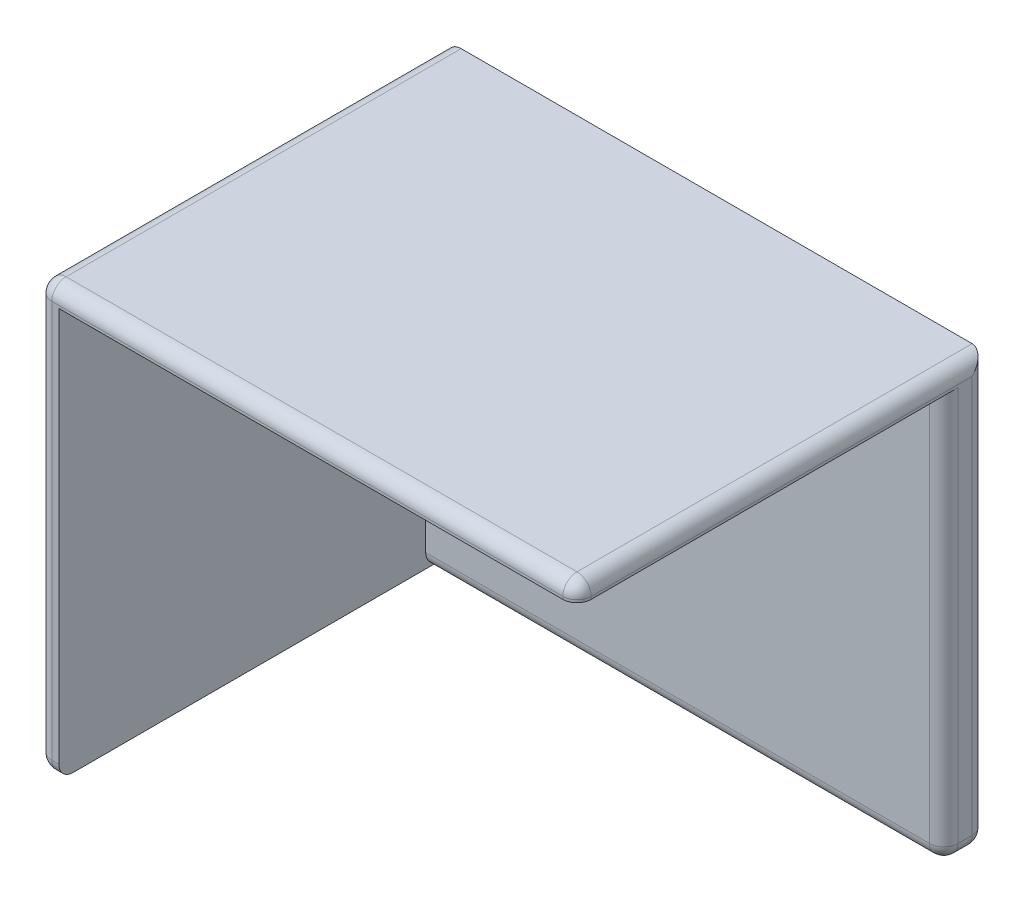
ISO-10303-21;
HEADER;
FILE_DESCRIPTION(('STEP AP214'),'2;1');
FILE_NAME('part.step','',(''),(''),'','','');
FILE_SCHEMA(('AUTOMOTIVE_DESIGN { 1 0 10303 214 1 1 1 1 }'));
ENDSEC;
DATA;
#1=APPLICATION_CONTEXT('core data for automotive mechanical design processes');
#2=APPLICATION_PROTOCOL_DEFINITION('international standard','automotive_design',2000,#1);
#3=PRODUCT_CONTEXT('',#1,'mechanical');
#4=PRODUCT('Part','Part','',(#3));
#5=PRODUCT_RELATED_PRODUCT_CATEGORY('part','',(#4));
#6=PRODUCT_DEFINITION_FORMATION('','',#4);
#7=PRODUCT_DEFINITION_CONTEXT('part definition',#1,'design');
#8=PRODUCT_DEFINITION('design','',#6,#7);
#9=PRODUCT_DEFINITION_SHAPE('','',#8);
#10=(LENGTH_UNIT() NAMED_UNIT(*) SI_UNIT(.MILLI.,.METRE.));
#11=(NAMED_UNIT(*) PLANE_ANGLE_UNIT() SI_UNIT($,.RADIAN.));
#12=(NAMED_UNIT(*) SI_UNIT($,.STERADIAN.) SOLID_ANGLE_UNIT());
#13=UNCERTAINTY_MEASURE_WITH_UNIT(LENGTH_MEASURE(1.E-05),#10,'distance_accuracy_value','');
#14=(GEOMETRIC_REPRESENTATION_CONTEXT(3) GLOBAL_UNCERTAINTY_ASSIGNED_CONTEXT((#13)) GLOBAL_UNIT_ASSIGNED_CONTEXT((#10,
#11,#12)) REPRESENTATION_CONTEXT('',''));
#15=CARTESIAN_POINT('',(0.,0.,0.));
#16=DIRECTION('',(0.,0.,1.));
#17=DIRECTION('',(1.,0.,0.));
#18=AXIS2_PLACEMENT_3D('',#15,#16,#17);
#19=CARTESIAN_POINT('',(-17.5,-13.8157894736842,28.84));
#20=DIRECTION('',(1.,0.,0.));
#21=DIRECTION('',(0.,0.,-1.));
#22=AXIS2_PLACEMENT_3D('',#19,#20,#21);
#23=PLANE('',#22);
#24=DIRECTION('',(0.,-1.,0.));
#25=VECTOR('',#24,1.);
#26=CARTESIAN_POINT('',(-17.5,-13.8157894736842,28.84));
#27=LINE('',#26,#25);
#28=CARTESIAN_POINT('',(-17.5,13.8157894736842,28.84));
#29=VERTEX_POINT('',#28);
#30=CARTESIAN_POINT('',(-17.5,-14.,28.84));
#31=VERTEX_POINT('',#30);
#32=EDGE_CURVE('E153',#29,#31,#27,.T.);
#33=ORIENTED_EDGE('',*,*,#32,.T.);
#34=CARTESIAN_POINT('',(-17.5,-14.,27.84));
#35=DIRECTION('',(-1.,0.,0.));
#36=DIRECTION('',(0.,0.,1.));
#37=AXIS2_PLACEMENT_3D('',#34,#35,#36);
#38=CIRCLE('',#37,1.);
#39=CARTESIAN_POINT('',(-17.5,-15.,27.84));
#40=VERTEX_POINT('',#39);
#41=EDGE_CURVE('E147',#31,#40,#38,.F.);
#42=ORIENTED_EDGE('',*,*,#41,.T.);
#43=DIRECTION('',(0.,0.,-1.));
#44=VECTOR('',#43,1.);
#45=CARTESIAN_POINT('',(-17.5,-15.,28.84));
#46=LINE('',#45,#44);
#47=CARTESIAN_POINT('',(-17.5,-15.,2.));
#48=VERTEX_POINT('',#47);
#49=EDGE_CURVE('E149',#40,#48,#46,.T.);
#50=ORIENTED_EDGE('',*,*,#49,.T.);
#51=CARTESIAN_POINT('',(-17.5,-14.,2.));
#52=DIRECTION('',(1.,0.,0.));
#53=DIRECTION('',(0.,0.,-1.));
#54=AXIS2_PLACEMENT_3D('',#51,#52,#53);
#55=CIRCLE('',#54,1.);
#56=CARTESIAN_POINT('',(-17.5,-14.,3.));
#57=VERTEX_POINT('',#56);
#58=EDGE_CURVE('E44',#48,#57,#55,.F.);
#59=ORIENTED_EDGE('',*,*,#58,.T.);
#60=DIRECTION('',(0.,1.,0.));
#61=VECTOR('',#60,1.);
#62=CARTESIAN_POINT('',(-17.5,13.8157894736842,3.));
#63=LINE('',#62,#61);
#64=CARTESIAN_POINT('',(-17.5,13.8157894736842,3.));
#65=VERTEX_POINT('',#64);
#66=EDGE_CURVE('E297',#57,#65,#63,.T.);
#67=ORIENTED_EDGE('',*,*,#66,.T.);
#68=DIRECTION('',(0.,0.,-1.));
#69=VECTOR('',#68,1.);
#70=CARTESIAN_POINT('',(-17.5,13.8157894736842,28.84));
#71=LINE('',#70,#69);
#72=EDGE_CURVE('E288',#29,#65,#71,.T.);
#73=ORIENTED_EDGE('',*,*,#72,.F.);
#74=EDGE_LOOP('',(#33,#42,#50,#59,#67,#73));
#75=FACE_BOUND('',#74,.T.);
#76=ADVANCED_FACE('F35',(#75),#23,.T.);
#77=CARTESIAN_POINT('',(17.5,13.8157894736842,28.84));
#78=DIRECTION('',(0.,-1.,0.));
#79=DIRECTION('',(0.,0.,-1.));
#80=AXIS2_PLACEMENT_3D('',#77,#78,#79);
#81=PLANE('',#80);
#82=ORIENTED_EDGE('',*,*,#72,.T.);
#83=DIRECTION('',(1.,0.,0.));
#84=VECTOR('',#83,1.);
#85=CARTESIAN_POINT('',(17.5,13.8157894736842,3.));
#86=LINE('',#85,#84);
#87=CARTESIAN_POINT('',(18.,13.8157894736842,3.));
#88=VERTEX_POINT('',#87);
#89=EDGE_CURVE('E294',#65,#88,#86,.T.);
#90=ORIENTED_EDGE('',*,*,#89,.T.);
#91=CARTESIAN_POINT('',(18.,13.8157894736842,2.));
#92=DIRECTION('',(0.,-1.,0.));
#93=DIRECTION('',(0.,0.,-1.));
#94=AXIS2_PLACEMENT_3D('',#91,#92,#93);
#95=CIRCLE('',#94,1.);
#96=CARTESIAN_POINT('',(19.,13.8157894736842,2.));
#97=VERTEX_POINT('',#96);
#98=EDGE_CURVE('E11',#88,#97,#95,.F.);
#99=ORIENTED_EDGE('',*,*,#98,.T.);
#100=DIRECTION('',(0.,0.,-1.));
#101=VECTOR('',#100,1.);
#102=CARTESIAN_POINT('',(19.,13.8157894736842,28.84));
#103=LINE('',#102,#101);
#104=CARTESIAN_POINT('',(19.,13.8157894736842,27.84));
#105=VERTEX_POINT('',#104);
#106=EDGE_CURVE('E159',#105,#97,#103,.T.);
#107=ORIENTED_EDGE('',*,*,#106,.F.);
#108=CARTESIAN_POINT('',(18.,13.8157894736842,27.84));
#109=DIRECTION('',(0.,1.,0.));
#110=DIRECTION('',(0.,0.,1.));
#111=AXIS2_PLACEMENT_3D('',#108,#109,#110);
#112=CIRCLE('',#111,1.);
#113=CARTESIAN_POINT('',(18.,13.8157894736842,28.84));
#114=VERTEX_POINT('',#113);
#115=EDGE_CURVE('E158',#105,#114,#112,.F.);
#116=ORIENTED_EDGE('',*,*,#115,.T.);
#117=DIRECTION('',(-1.,0.,0.));
#118=VECTOR('',#117,1.);
#119=CARTESIAN_POINT('',(17.5,13.8157894736842,28.84));
#120=LINE('',#119,#118);
#121=EDGE_CURVE('E291',#114,#29,#120,.T.);
#122=ORIENTED_EDGE('',*,*,#121,.T.);
#123=EDGE_LOOP('',(#82,#90,#99,#107,#116,#122));
#124=FACE_BOUND('',#123,.T.);
#125=ADVANCED_FACE('F310',(#124),#81,.T.);
#126=CARTESIAN_POINT('',(0.,0.,28.84));
#127=DIRECTION('',(0.,0.,1.));
#128=DIRECTION('',(1.,0.,0.));
#129=AXIS2_PLACEMENT_3D('',#126,#127,#128);
#130=PLANE('',#129);
#131=ORIENTED_EDGE('',*,*,#121,.F.);
#132=DIRECTION('',(0.,1.,0.));
#133=VECTOR('',#132,1.);
#134=CARTESIAN_POINT('',(18.,15.,28.84));
#135=LINE('',#134,#133);
#136=CARTESIAN_POINT('',(18.,14.,28.84));
#137=VERTEX_POINT('',#136);
#138=EDGE_CURVE('E180',#114,#137,#135,.T.);
#139=ORIENTED_EDGE('',*,*,#138,.T.);
#140=DIRECTION('',(-1.,0.,0.));
#141=VECTOR('',#140,1.);
#142=CARTESIAN_POINT('',(-19.,14.,28.84));
#143=LINE('',#142,#141);
#144=CARTESIAN_POINT('',(-18.,14.,28.84));
#145=VERTEX_POINT('',#144);
#146=EDGE_CURVE('E278',#137,#145,#143,.T.);
#147=ORIENTED_EDGE('',*,*,#146,.T.);
#148=DIRECTION('',(0.,-1.,0.));
#149=VECTOR('',#148,1.);
#150=CARTESIAN_POINT('',(-18.,-15.,28.84));
#151=LINE('',#150,#149);
#152=CARTESIAN_POINT('',(-18.,-14.,28.84));
#153=VERTEX_POINT('',#152);
#154=EDGE_CURVE('E271',#145,#153,#151,.T.);
#155=ORIENTED_EDGE('',*,*,#154,.T.);
#156=DIRECTION('',(1.,0.,0.));
#157=VECTOR('',#156,1.);
#158=CARTESIAN_POINT('',(19.,-14.,28.84));
#159=LINE('',#158,#157);
#160=EDGE_CURVE('E275',#153,#31,#159,.T.);
#161=ORIENTED_EDGE('',*,*,#160,.T.);
#162=ORIENTED_EDGE('',*,*,#32,.F.);
#163=EDGE_LOOP('',(#131,#139,#147,#155,#161,#162));
#164=FACE_BOUND('',#163,.T.);
#165=ADVANCED_FACE('F274',(#164),#130,.T.);
#166=CARTESIAN_POINT('',(0.,0.,0.));
#167=DIRECTION('',(0.,0.,1.));
#168=DIRECTION('',(1.,0.,0.));
#169=AXIS2_PLACEMENT_3D('',#166,#167,#168);
#170=PLANE('',#169);
#171=DIRECTION('',(-1.,0.,0.));
#172=VECTOR('',#171,1.);
#173=CARTESIAN_POINT('',(19.,15.,0.));
#174=LINE('',#173,#172);
#175=CARTESIAN_POINT('',(18.,15.,0.));
#176=VERTEX_POINT('',#175);
#177=CARTESIAN_POINT('',(-18.,15.,0.));
#178=VERTEX_POINT('',#177);
#179=EDGE_CURVE('E283',#176,#178,#174,.T.);
#180=ORIENTED_EDGE('',*,*,#179,.F.);
#181=DIRECTION('',(0.,1.,0.));
#182=VECTOR('',#181,1.);
#183=CARTESIAN_POINT('',(18.,0.,0.));
#184=LINE('',#183,#182);
#185=CARTESIAN_POINT('',(18.,-14.,0.));
#186=VERTEX_POINT('',#185);
#187=EDGE_CURVE('E52',#176,#186,#184,.F.);
#188=ORIENTED_EDGE('',*,*,#187,.T.);
#189=DIRECTION('',(1.,0.,0.));
#190=VECTOR('',#189,1.);
#191=CARTESIAN_POINT('',(0.,-14.,0.));
#192=LINE('',#191,#190);
#193=CARTESIAN_POINT('',(-19.,-14.,0.));
#194=VERTEX_POINT('',#193);
#195=EDGE_CURVE('E219',#186,#194,#192,.F.);
#196=ORIENTED_EDGE('',*,*,#195,.T.);
#197=DIRECTION('',(0.,-1.,0.));
#198=VECTOR('',#197,1.);
#199=CARTESIAN_POINT('',(-19.,-15.,0.));
#200=LINE('',#199,#198);
#201=CARTESIAN_POINT('',(-19.,14.,0.));
#202=VERTEX_POINT('',#201);
#203=EDGE_CURVE('E285',#202,#194,#200,.T.);
#204=ORIENTED_EDGE('',*,*,#203,.F.);
#205=CARTESIAN_POINT('',(-18.,14.,0.));
#206=DIRECTION('',(0.,0.,1.));
#207=DIRECTION('',(1.,0.,0.));
#208=AXIS2_PLACEMENT_3D('',#205,#206,#207);
#209=CIRCLE('',#208,1.);
#210=EDGE_CURVE('E58',#202,#178,#209,.F.);
#211=ORIENTED_EDGE('',*,*,#210,.T.);
#212=EDGE_LOOP('',(#180,#188,#196,#204,#211));
#213=FACE_BOUND('',#212,.T.);
#214=ADVANCED_FACE('F355',(#213),#170,.F.);
#215=CARTESIAN_POINT('',(-19.,-15.,28.84));
#216=DIRECTION('',(1.,0.,0.));
#217=DIRECTION('',(0.,0.,-1.));
#218=AXIS2_PLACEMENT_3D('',#215,#216,#217);
#219=PLANE('',#218);
#220=ORIENTED_EDGE('',*,*,#203,.T.);
#221=DIRECTION('',(0.,0.,-1.));
#222=VECTOR('',#221,1.);
#223=CARTESIAN_POINT('',(-19.,-14.,28.84));
#224=LINE('',#223,#222);
#225=CARTESIAN_POINT('',(-19.,-14.,27.84));
#226=VERTEX_POINT('',#225);
#227=EDGE_CURVE('E228',#194,#226,#224,.F.);
#228=ORIENTED_EDGE('',*,*,#227,.T.);
#229=DIRECTION('',(0.,-1.,0.));
#230=VECTOR('',#229,1.);
#231=CARTESIAN_POINT('',(-19.,15.,27.84));
#232=LINE('',#231,#230);
#233=CARTESIAN_POINT('',(-19.,14.,27.84));
#234=VERTEX_POINT('',#233);
#235=EDGE_CURVE('E174',#226,#234,#232,.F.);
#236=ORIENTED_EDGE('',*,*,#235,.T.);
#237=DIRECTION('',(0.,0.,-1.));
#238=VECTOR('',#237,1.);
#239=CARTESIAN_POINT('',(-19.,14.,28.84));
#240=LINE('',#239,#238);
#241=EDGE_CURVE('E226',#234,#202,#240,.T.);
#242=ORIENTED_EDGE('',*,*,#241,.T.);
#243=EDGE_LOOP('',(#220,#228,#236,#242));
#244=FACE_BOUND('',#243,.T.);
#245=ADVANCED_FACE('F350',(#244),#219,.F.);
#246=CARTESIAN_POINT('',(19.,-15.,28.84));
#247=DIRECTION('',(0.,1.,0.));
#248=DIRECTION('',(-1.,0.,0.));
#249=AXIS2_PLACEMENT_3D('',#246,#247,#248);
#250=PLANE('',#249);
#251=DIRECTION('',(-1.,0.,0.));
#252=VECTOR('',#251,1.);
#253=CARTESIAN_POINT('',(19.,-15.,2.));
#254=LINE('',#253,#252);
#255=CARTESIAN_POINT('',(18.,-15.,2.));
#256=VERTEX_POINT('',#255);
#257=EDGE_CURVE('E167',#256,#48,#254,.T.);
#258=ORIENTED_EDGE('',*,*,#257,.T.);
#259=ORIENTED_EDGE('',*,*,#49,.F.);
#260=DIRECTION('',(1.,0.,0.));
#261=VECTOR('',#260,1.);
#262=CARTESIAN_POINT('',(-19.,-15.,27.84));
#263=LINE('',#262,#261);
#264=CARTESIAN_POINT('',(-18.,-15.,27.84));
#265=VERTEX_POINT('',#264);
#266=EDGE_CURVE('E164',#40,#265,#263,.F.);
#267=ORIENTED_EDGE('',*,*,#266,.T.);
#268=DIRECTION('',(0.,0.,-1.));
#269=VECTOR('',#268,1.);
#270=CARTESIAN_POINT('',(-18.,-15.,28.84));
#271=LINE('',#270,#269);
#272=CARTESIAN_POINT('',(-18.,-15.,1.));
#273=VERTEX_POINT('',#272);
#274=EDGE_CURVE('E199',#265,#273,#271,.T.);
#275=ORIENTED_EDGE('',*,*,#274,.T.);
#276=DIRECTION('',(1.,0.,0.));
#277=VECTOR('',#276,1.);
#278=CARTESIAN_POINT('',(19.,-15.,1.));
#279=LINE('',#278,#277);
#280=CARTESIAN_POINT('',(18.,-15.,1.));
#281=VERTEX_POINT('',#280);
#282=EDGE_CURVE('E201',#273,#281,#279,.T.);
#283=ORIENTED_EDGE('',*,*,#282,.T.);
#284=DIRECTION('',(0.,0.,-1.));
#285=VECTOR('',#284,1.);
#286=CARTESIAN_POINT('',(18.,-15.,28.84));
#287=LINE('',#286,#285);
#288=EDGE_CURVE('E203',#281,#256,#287,.F.);
#289=ORIENTED_EDGE('',*,*,#288,.T.);
#290=EDGE_LOOP('',(#258,#259,#267,#275,#283,#289));
#291=FACE_BOUND('',#290,.T.);
#292=ADVANCED_FACE('F163',(#291),#250,.F.);
#293=CARTESIAN_POINT('',(19.,-15.,28.84));
#294=DIRECTION('',(-1.,0.,0.));
#295=DIRECTION('',(0.,-1.,0.));
#296=AXIS2_PLACEMENT_3D('',#293,#294,#295);
#297=PLANE('',#296);
#298=ORIENTED_EDGE('',*,*,#106,.T.);
#299=DIRECTION('',(0.,-1.,0.));
#300=VECTOR('',#299,1.);
#301=CARTESIAN_POINT('',(19.,-15.,2.));
#302=LINE('',#301,#300);
#303=CARTESIAN_POINT('',(19.,-14.,2.));
#304=VERTEX_POINT('',#303);
#305=EDGE_CURVE('E216',#97,#304,#302,.T.);
#306=ORIENTED_EDGE('',*,*,#305,.T.);
#307=DIRECTION('',(0.,0.,-1.));
#308=VECTOR('',#307,1.);
#309=CARTESIAN_POINT('',(19.,-14.,28.84));
#310=LINE('',#309,#308);
#311=CARTESIAN_POINT('',(19.,-14.,1.));
#312=VERTEX_POINT('',#311);
#313=EDGE_CURVE('E214',#304,#312,#310,.T.);
#314=ORIENTED_EDGE('',*,*,#313,.T.);
#315=DIRECTION('',(0.,1.,0.));
#316=VECTOR('',#315,1.);
#317=CARTESIAN_POINT('',(19.,-15.,1.));
#318=LINE('',#317,#316);
#319=CARTESIAN_POINT('',(19.,14.,1.));
#320=VERTEX_POINT('',#319);
#321=EDGE_CURVE('E212',#312,#320,#318,.T.);
#322=ORIENTED_EDGE('',*,*,#321,.T.);
#323=DIRECTION('',(0.,0.,-1.));
#324=VECTOR('',#323,1.);
#325=CARTESIAN_POINT('',(19.,14.,28.84));
#326=LINE('',#325,#324);
#327=CARTESIAN_POINT('',(19.,14.,27.84));
#328=VERTEX_POINT('',#327);
#329=EDGE_CURVE('E210',#320,#328,#326,.F.);
#330=ORIENTED_EDGE('',*,*,#329,.T.);
#331=DIRECTION('',(0.,1.,0.));
#332=VECTOR('',#331,1.);
#333=CARTESIAN_POINT('',(19.,-15.,27.84));
#334=LINE('',#333,#332);
#335=EDGE_CURVE('E175',#328,#105,#334,.F.);
#336=ORIENTED_EDGE('',*,*,#335,.T.);
#337=EDGE_LOOP('',(#298,#306,#314,#322,#330,#336));
#338=FACE_BOUND('',#337,.T.);
#339=ADVANCED_FACE('F303',(#338),#297,.F.);
#340=CARTESIAN_POINT('',(19.,15.,28.84));
#341=DIRECTION('',(0.,-1.,0.));
#342=DIRECTION('',(1.,0.,0.));
#343=AXIS2_PLACEMENT_3D('',#340,#341,#342);
#344=PLANE('',#343);
#345=DIRECTION('',(-1.,0.,0.));
#346=VECTOR('',#345,1.);
#347=CARTESIAN_POINT('',(19.,15.,27.84));
#348=LINE('',#347,#346);
#349=CARTESIAN_POINT('',(-18.,15.,27.84));
#350=VERTEX_POINT('',#349);
#351=CARTESIAN_POINT('',(18.,15.,27.84));
#352=VERTEX_POINT('',#351);
#353=EDGE_CURVE('E178',#350,#352,#348,.F.);
#354=ORIENTED_EDGE('',*,*,#353,.T.);
#355=DIRECTION('',(0.,0.,-1.));
#356=VECTOR('',#355,1.);
#357=CARTESIAN_POINT('',(18.,15.,28.84));
#358=LINE('',#357,#356);
#359=EDGE_CURVE('E224',#352,#176,#358,.T.);
#360=ORIENTED_EDGE('',*,*,#359,.T.);
#361=ORIENTED_EDGE('',*,*,#179,.T.);
#362=DIRECTION('',(0.,0.,-1.));
#363=VECTOR('',#362,1.);
#364=CARTESIAN_POINT('',(-18.,15.,28.84));
#365=LINE('',#364,#363);
#366=EDGE_CURVE('E222',#178,#350,#365,.F.);
#367=ORIENTED_EDGE('',*,*,#366,.T.);
#368=EDGE_LOOP('',(#354,#360,#361,#367));
#369=FACE_BOUND('',#368,.T.);
#370=ADVANCED_FACE('F354',(#369),#344,.F.);
#371=CARTESIAN_POINT('',(-18.,0.,27.84));
#372=DIRECTION('',(0.,1.,0.));
#373=DIRECTION('',(0.,0.,1.));
#374=AXIS2_PLACEMENT_3D('',#371,#372,#373);
#375=CYLINDRICAL_SURFACE('',#374,1.);
#376=ORIENTED_EDGE('',*,*,#235,.F.);
#377=CARTESIAN_POINT('',(-18.,-14.,27.84));
#378=DIRECTION('',(0.,1.,0.));
#379=DIRECTION('',(0.,0.,1.));
#380=AXIS2_PLACEMENT_3D('',#377,#378,#379);
#381=CIRCLE('',#380,1.);
#382=EDGE_CURVE('E197',#226,#153,#381,.T.);
#383=ORIENTED_EDGE('',*,*,#382,.T.);
#384=ORIENTED_EDGE('',*,*,#154,.F.);
#385=CARTESIAN_POINT('',(-18.,14.,27.84));
#386=DIRECTION('',(0.,1.,0.));
#387=DIRECTION('',(0.,0.,1.));
#388=AXIS2_PLACEMENT_3D('',#385,#386,#387);
#389=CIRCLE('',#388,1.);
#390=EDGE_CURVE('E195',#145,#234,#389,.F.);
#391=ORIENTED_EDGE('',*,*,#390,.T.);
#392=EDGE_LOOP('',(#376,#383,#384,#391));
#393=FACE_BOUND('',#392,.T.);
#394=ADVANCED_FACE('F270',(#393),#375,.T.);
#395=CARTESIAN_POINT('',(0.,-14.,27.84));
#396=DIRECTION('',(-1.,0.,0.));
#397=DIRECTION('',(0.,-1.,0.));
#398=AXIS2_PLACEMENT_3D('',#395,#396,#397);
#399=CYLINDRICAL_SURFACE('',#398,1.);
#400=ORIENTED_EDGE('',*,*,#160,.F.);
#401=CARTESIAN_POINT('',(-18.,-14.,27.84));
#402=DIRECTION('',(-1.,0.,0.));
#403=DIRECTION('',(0.,-1.,0.));
#404=AXIS2_PLACEMENT_3D('',#401,#402,#403);
#405=CIRCLE('',#404,1.);
#406=EDGE_CURVE('E173',#153,#265,#405,.F.);
#407=ORIENTED_EDGE('',*,*,#406,.T.);
#408=ORIENTED_EDGE('',*,*,#266,.F.);
#409=ORIENTED_EDGE('',*,*,#41,.F.);
#410=EDGE_LOOP('',(#400,#407,#408,#409));
#411=FACE_BOUND('',#410,.T.);
#412=ADVANCED_FACE('F171',(#411),#399,.T.);
#413=CARTESIAN_POINT('',(0.,14.,27.84));
#414=DIRECTION('',(1.,0.,0.));
#415=DIRECTION('',(0.,1.,0.));
#416=AXIS2_PLACEMENT_3D('',#413,#414,#415);
#417=CYLINDRICAL_SURFACE('',#416,1.);
#418=ORIENTED_EDGE('',*,*,#146,.F.);
#419=CARTESIAN_POINT('',(18.,14.,27.84));
#420=DIRECTION('',(1.,0.,0.));
#421=DIRECTION('',(0.,1.,0.));
#422=AXIS2_PLACEMENT_3D('',#419,#420,#421);
#423=CIRCLE('',#422,1.);
#424=EDGE_CURVE('E192',#137,#352,#423,.F.);
#425=ORIENTED_EDGE('',*,*,#424,.T.);
#426=ORIENTED_EDGE('',*,*,#353,.F.);
#427=CARTESIAN_POINT('',(-18.,14.,27.84));
#428=DIRECTION('',(1.,0.,0.));
#429=DIRECTION('',(0.,1.,0.));
#430=AXIS2_PLACEMENT_3D('',#427,#428,#429);
#431=CIRCLE('',#430,1.);
#432=EDGE_CURVE('E189',#350,#145,#431,.T.);
#433=ORIENTED_EDGE('',*,*,#432,.T.);
#434=EDGE_LOOP('',(#418,#425,#426,#433));
#435=FACE_BOUND('',#434,.T.);
#436=ADVANCED_FACE('F341',(#435),#417,.T.);
#437=CARTESIAN_POINT('',(18.,0.,27.84));
#438=DIRECTION('',(0.,-1.,0.));
#439=DIRECTION('',(1.,0.,0.));
#440=AXIS2_PLACEMENT_3D('',#437,#438,#439);
#441=CYLINDRICAL_SURFACE('',#440,1.);
#442=ORIENTED_EDGE('',*,*,#335,.F.);
#443=CARTESIAN_POINT('',(18.,14.,27.84));
#444=DIRECTION('',(0.,-1.,0.));
#445=DIRECTION('',(1.,0.,0.));
#446=AXIS2_PLACEMENT_3D('',#443,#444,#445);
#447=CIRCLE('',#446,1.);
#448=EDGE_CURVE('E186',#328,#137,#447,.T.);
#449=ORIENTED_EDGE('',*,*,#448,.T.);
#450=ORIENTED_EDGE('',*,*,#138,.F.);
#451=ORIENTED_EDGE('',*,*,#115,.F.);
#452=EDGE_LOOP('',(#442,#449,#450,#451));
#453=FACE_BOUND('',#452,.T.);
#454=ADVANCED_FACE('F339',(#453),#441,.T.);
#455=CARTESIAN_POINT('',(0.,0.,3.));
#456=DIRECTION('',(0.,0.,-1.));
#457=DIRECTION('',(-1.,0.,0.));
#458=AXIS2_PLACEMENT_3D('',#455,#456,#457);
#459=PLANE('',#458);
#460=ORIENTED_EDGE('',*,*,#66,.F.);
#461=DIRECTION('',(-1.,0.,0.));
#462=VECTOR('',#461,1.);
#463=CARTESIAN_POINT('',(0.,-14.,3.));
#464=LINE('',#463,#462);
#465=CARTESIAN_POINT('',(18.,-14.,3.));
#466=VERTEX_POINT('',#465);
#467=EDGE_CURVE('E208',#57,#466,#464,.F.);
#468=ORIENTED_EDGE('',*,*,#467,.T.);
#469=DIRECTION('',(0.,-1.,0.));
#470=VECTOR('',#469,1.);
#471=CARTESIAN_POINT('',(18.,0.,3.));
#472=LINE('',#471,#470);
#473=EDGE_CURVE('E206',#466,#88,#472,.F.);
#474=ORIENTED_EDGE('',*,*,#473,.T.);
#475=ORIENTED_EDGE('',*,*,#89,.F.);
#476=EDGE_LOOP('',(#460,#468,#474,#475));
#477=FACE_BOUND('',#476,.T.);
#478=ADVANCED_FACE('F372',(#477),#459,.F.);
#479=CARTESIAN_POINT('',(-18.,-14.,27.84));
#480=DIRECTION('',(0.,0.,1.));
#481=DIRECTION('',(1.,0.,0.));
#482=AXIS2_PLACEMENT_3D('',#479,#480,#481);
#483=SPHERICAL_SURFACE('',#482,1.);
#484=ORIENTED_EDGE('',*,*,#406,.F.);
#485=ORIENTED_EDGE('',*,*,#382,.F.);
#486=CARTESIAN_POINT('',(-18.,-14.,27.84));
#487=DIRECTION('',(0.,0.,-1.));
#488=DIRECTION('',(-1.,0.,0.));
#489=AXIS2_PLACEMENT_3D('',#486,#487,#488);
#490=CIRCLE('',#489,1.);
#491=EDGE_CURVE('E169',#265,#226,#490,.T.);
#492=ORIENTED_EDGE('',*,*,#491,.F.);
#493=EDGE_LOOP('',(#484,#485,#492));
#494=FACE_BOUND('',#493,.T.);
#495=ADVANCED_FACE('F265',(#494),#483,.T.);
#496=CARTESIAN_POINT('',(19.,-14.,2.));
#497=DIRECTION('',(-1.,0.,0.));
#498=DIRECTION('',(0.,-1.,0.));
#499=AXIS2_PLACEMENT_3D('',#496,#497,#498);
#500=CYLINDRICAL_SURFACE('',#499,1.);
#501=ORIENTED_EDGE('',*,*,#58,.F.);
#502=ORIENTED_EDGE('',*,*,#257,.F.);
#503=CARTESIAN_POINT('',(18.,-14.,2.));
#504=DIRECTION('',(1.,0.,0.));
#505=DIRECTION('',(0.,0.,-1.));
#506=AXIS2_PLACEMENT_3D('',#503,#504,#505);
#507=CIRCLE('',#506,1.);
#508=EDGE_CURVE('E255',#466,#256,#507,.T.);
#509=ORIENTED_EDGE('',*,*,#508,.F.);
#510=ORIENTED_EDGE('',*,*,#467,.F.);
#511=EDGE_LOOP('',(#501,#502,#509,#510));
#512=FACE_BOUND('',#511,.T.);
#513=ADVANCED_FACE('F379',(#512),#500,.T.);
#514=CARTESIAN_POINT('',(18.,-15.,2.));
#515=DIRECTION('',(0.,-1.,0.));
#516=DIRECTION('',(1.,0.,0.));
#517=AXIS2_PLACEMENT_3D('',#514,#515,#516);
#518=CYLINDRICAL_SURFACE('',#517,1.);
#519=ORIENTED_EDGE('',*,*,#98,.F.);
#520=ORIENTED_EDGE('',*,*,#473,.F.);
#521=CARTESIAN_POINT('',(18.,-14.,2.));
#522=DIRECTION('',(0.,-1.,0.));
#523=DIRECTION('',(0.,0.,-1.));
#524=AXIS2_PLACEMENT_3D('',#521,#522,#523);
#525=CIRCLE('',#524,1.);
#526=EDGE_CURVE('E252',#304,#466,#525,.T.);
#527=ORIENTED_EDGE('',*,*,#526,.F.);
#528=ORIENTED_EDGE('',*,*,#305,.F.);
#529=EDGE_LOOP('',(#519,#520,#527,#528));
#530=FACE_BOUND('',#529,.T.);
#531=ADVANCED_FACE('F314',(#530),#518,.T.);
#532=CARTESIAN_POINT('',(-18.,-14.,28.84));
#533=DIRECTION('',(0.,0.,-1.));
#534=DIRECTION('',(-1.,0.,0.));
#535=AXIS2_PLACEMENT_3D('',#532,#533,#534);
#536=CYLINDRICAL_SURFACE('',#535,1.);
#537=ORIENTED_EDGE('',*,*,#491,.T.);
#538=ORIENTED_EDGE('',*,*,#227,.F.);
#539=CARTESIAN_POINT('',(-18.,-14.,1.));
#540=DIRECTION('',(0.707106781186547,0.,-0.707106781186547));
#541=DIRECTION('',(-0.707106781186547,0.,-0.707106781186547));
#542=AXIS2_PLACEMENT_3D('',#539,#540,#541);
#543=ELLIPSE('',#542,1.41421356237309,1.);
#544=EDGE_CURVE('E249',#273,#194,#543,.T.);
#545=ORIENTED_EDGE('',*,*,#544,.F.);
#546=ORIENTED_EDGE('',*,*,#274,.F.);
#547=EDGE_LOOP('',(#537,#538,#545,#546));
#548=FACE_BOUND('',#547,.T.);
#549=ADVANCED_FACE('F261',(#548),#536,.T.);
#550=CARTESIAN_POINT('',(18.,-14.,2.));
#551=DIRECTION('',(0.,0.,1.));
#552=DIRECTION('',(1.,0.,0.));
#553=AXIS2_PLACEMENT_3D('',#550,#551,#552);
#554=SPHERICAL_SURFACE('',#553,1.);
#555=ORIENTED_EDGE('',*,*,#526,.T.);
#556=ORIENTED_EDGE('',*,*,#508,.T.);
#557=CARTESIAN_POINT('',(18.,-14.,2.));
#558=DIRECTION('',(0.,0.,1.));
#559=DIRECTION('',(1.,0.,0.));
#560=AXIS2_PLACEMENT_3D('',#557,#558,#559);
#561=CIRCLE('',#560,1.);
#562=EDGE_CURVE('E246',#304,#256,#561,.F.);
#563=ORIENTED_EDGE('',*,*,#562,.F.);
#564=EDGE_LOOP('',(#555,#556,#563));
#565=FACE_BOUND('',#564,.T.);
#566=ADVANCED_FACE('F319',(#565),#554,.T.);
#567=CARTESIAN_POINT('',(19.,-14.,1.));
#568=DIRECTION('',(1.,0.,0.));
#569=DIRECTION('',(0.,1.,0.));
#570=AXIS2_PLACEMENT_3D('',#567,#568,#569);
#571=CYLINDRICAL_SURFACE('',#570,1.);
#572=ORIENTED_EDGE('',*,*,#544,.T.);
#573=ORIENTED_EDGE('',*,*,#195,.F.);
#574=CARTESIAN_POINT('',(18.,-14.,1.));
#575=DIRECTION('',(1.,0.,0.));
#576=DIRECTION('',(0.,0.,-1.));
#577=AXIS2_PLACEMENT_3D('',#574,#575,#576);
#578=CIRCLE('',#577,1.);
#579=EDGE_CURVE('E243',#281,#186,#578,.T.);
#580=ORIENTED_EDGE('',*,*,#579,.F.);
#581=ORIENTED_EDGE('',*,*,#282,.F.);
#582=EDGE_LOOP('',(#572,#573,#580,#581));
#583=FACE_BOUND('',#582,.T.);
#584=ADVANCED_FACE('F415',(#583),#571,.T.);
#585=CARTESIAN_POINT('',(18.,-14.,28.84));
#586=DIRECTION('',(0.,0.,-1.));
#587=DIRECTION('',(-1.,0.,0.));
#588=AXIS2_PLACEMENT_3D('',#585,#586,#587);
#589=CYLINDRICAL_SURFACE('',#588,1.);
#590=ORIENTED_EDGE('',*,*,#562,.T.);
#591=ORIENTED_EDGE('',*,*,#288,.F.);
#592=CARTESIAN_POINT('',(18.,-14.,1.));
#593=DIRECTION('',(0.,0.,-1.));
#594=DIRECTION('',(-1.,0.,0.));
#595=AXIS2_PLACEMENT_3D('',#592,#593,#594);
#596=CIRCLE('',#595,1.);
#597=EDGE_CURVE('E240',#312,#281,#596,.T.);
#598=ORIENTED_EDGE('',*,*,#597,.F.);
#599=ORIENTED_EDGE('',*,*,#313,.F.);
#600=EDGE_LOOP('',(#590,#591,#598,#599));
#601=FACE_BOUND('',#600,.T.);
#602=ADVANCED_FACE('F323',(#601),#589,.T.);
#603=CARTESIAN_POINT('',(18.,-14.,1.));
#604=DIRECTION('',(0.,-1.,0.));
#605=DIRECTION('',(0.,0.,-1.));
#606=AXIS2_PLACEMENT_3D('',#603,#604,#605);
#607=SPHERICAL_SURFACE('',#606,1.);
#608=ORIENTED_EDGE('',*,*,#597,.T.);
#609=ORIENTED_EDGE('',*,*,#579,.T.);
#610=CARTESIAN_POINT('',(18.,-14.,1.));
#611=DIRECTION('',(0.,-1.,0.));
#612=DIRECTION('',(0.,0.,-1.));
#613=AXIS2_PLACEMENT_3D('',#610,#611,#612);
#614=CIRCLE('',#613,1.);
#615=EDGE_CURVE('E237',#312,#186,#614,.F.);
#616=ORIENTED_EDGE('',*,*,#615,.F.);
#617=EDGE_LOOP('',(#608,#609,#616));
#618=FACE_BOUND('',#617,.T.);
#619=ADVANCED_FACE('F409',(#618),#607,.T.);
#620=CARTESIAN_POINT('',(18.,-15.,1.));
#621=DIRECTION('',(0.,1.,0.));
#622=DIRECTION('',(-1.,0.,0.));
#623=AXIS2_PLACEMENT_3D('',#620,#621,#622);
#624=CYLINDRICAL_SURFACE('',#623,1.);
#625=ORIENTED_EDGE('',*,*,#615,.T.);
#626=ORIENTED_EDGE('',*,*,#187,.F.);
#627=CARTESIAN_POINT('',(18.,14.,1.));
#628=DIRECTION('',(0.,-0.707106781186547,-0.707106781186547));
#629=DIRECTION('',(0.,0.707106781186547,-0.707106781186547));
#630=AXIS2_PLACEMENT_3D('',#627,#628,#629);
#631=ELLIPSE('',#630,1.41421356237309,1.);
#632=EDGE_CURVE('E234',#320,#176,#631,.F.);
#633=ORIENTED_EDGE('',*,*,#632,.F.);
#634=ORIENTED_EDGE('',*,*,#321,.F.);
#635=EDGE_LOOP('',(#625,#626,#633,#634));
#636=FACE_BOUND('',#635,.T.);
#637=ADVANCED_FACE('F329',(#636),#624,.T.);
#638=CARTESIAN_POINT('',(18.,14.,28.84));
#639=DIRECTION('',(0.,0.,-1.));
#640=DIRECTION('',(-1.,0.,0.));
#641=AXIS2_PLACEMENT_3D('',#638,#639,#640);
#642=CYLINDRICAL_SURFACE('',#641,1.);
#643=ORIENTED_EDGE('',*,*,#632,.T.);
#644=ORIENTED_EDGE('',*,*,#359,.F.);
#645=CARTESIAN_POINT('',(18.,14.,27.84));
#646=DIRECTION('',(0.,0.,1.));
#647=DIRECTION('',(1.,0.,0.));
#648=AXIS2_PLACEMENT_3D('',#645,#646,#647);
#649=CIRCLE('',#648,1.);
#650=EDGE_CURVE('E231',#328,#352,#649,.T.);
#651=ORIENTED_EDGE('',*,*,#650,.F.);
#652=ORIENTED_EDGE('',*,*,#329,.F.);
#653=EDGE_LOOP('',(#643,#644,#651,#652));
#654=FACE_BOUND('',#653,.T.);
#655=ADVANCED_FACE('F333',(#654),#642,.T.);
#656=CARTESIAN_POINT('',(18.,14.,27.84));
#657=DIRECTION('',(0.,0.,1.));
#658=DIRECTION('',(1.,0.,0.));
#659=AXIS2_PLACEMENT_3D('',#656,#657,#658);
#660=SPHERICAL_SURFACE('',#659,1.);
#661=ORIENTED_EDGE('',*,*,#650,.T.);
#662=ORIENTED_EDGE('',*,*,#424,.F.);
#663=ORIENTED_EDGE('',*,*,#448,.F.);
#664=EDGE_LOOP('',(#661,#662,#663));
#665=FACE_BOUND('',#664,.T.);
#666=ADVANCED_FACE('F336',(#665),#660,.T.);
#667=CARTESIAN_POINT('',(-18.,14.,28.84));
#668=DIRECTION('',(0.,0.,-1.));
#669=DIRECTION('',(-1.,0.,0.));
#670=AXIS2_PLACEMENT_3D('',#667,#668,#669);
#671=CYLINDRICAL_SURFACE('',#670,1.);
#672=ORIENTED_EDGE('',*,*,#210,.F.);
#673=ORIENTED_EDGE('',*,*,#241,.F.);
#674=CARTESIAN_POINT('',(-18.,14.,27.84));
#675=DIRECTION('',(0.,0.,1.));
#676=DIRECTION('',(1.,0.,0.));
#677=AXIS2_PLACEMENT_3D('',#674,#675,#676);
#678=CIRCLE('',#677,1.);
#679=EDGE_CURVE('E39',#350,#234,#678,.T.);
#680=ORIENTED_EDGE('',*,*,#679,.F.);
#681=ORIENTED_EDGE('',*,*,#366,.F.);
#682=EDGE_LOOP('',(#672,#673,#680,#681));
#683=FACE_BOUND('',#682,.T.);
#684=ADVANCED_FACE('F37',(#683),#671,.T.);
#685=CARTESIAN_POINT('',(-18.,14.,27.84));
#686=DIRECTION('',(0.,0.,1.));
#687=DIRECTION('',(1.,0.,0.));
#688=AXIS2_PLACEMENT_3D('',#685,#686,#687);
#689=SPHERICAL_SURFACE('',#688,1.);
#690=ORIENTED_EDGE('',*,*,#679,.T.);
#691=ORIENTED_EDGE('',*,*,#390,.F.);
#692=ORIENTED_EDGE('',*,*,#432,.F.);
#693=EDGE_LOOP('',(#690,#691,#692));
#694=FACE_BOUND('',#693,.T.);
#695=ADVANCED_FACE('F347',(#694),#689,.T.);
#696=CLOSED_SHELL('',(#76,#125,#165,#214,#245,#292,#339,#370,#394,#412,#436,#454,#478,#495,#513,
#531,#549,#566,#584,#602,#619,#637,#655,#666,#684,#695));
#697=MANIFOLD_SOLID_BREP('B2',#696);
#698=ADVANCED_BREP_SHAPE_REPRESENTATION('',(#18,#697),#14);
#699=SHAPE_DEFINITION_REPRESENTATION(#9,#698);
ENDSEC;
END-ISO-10303-21;
